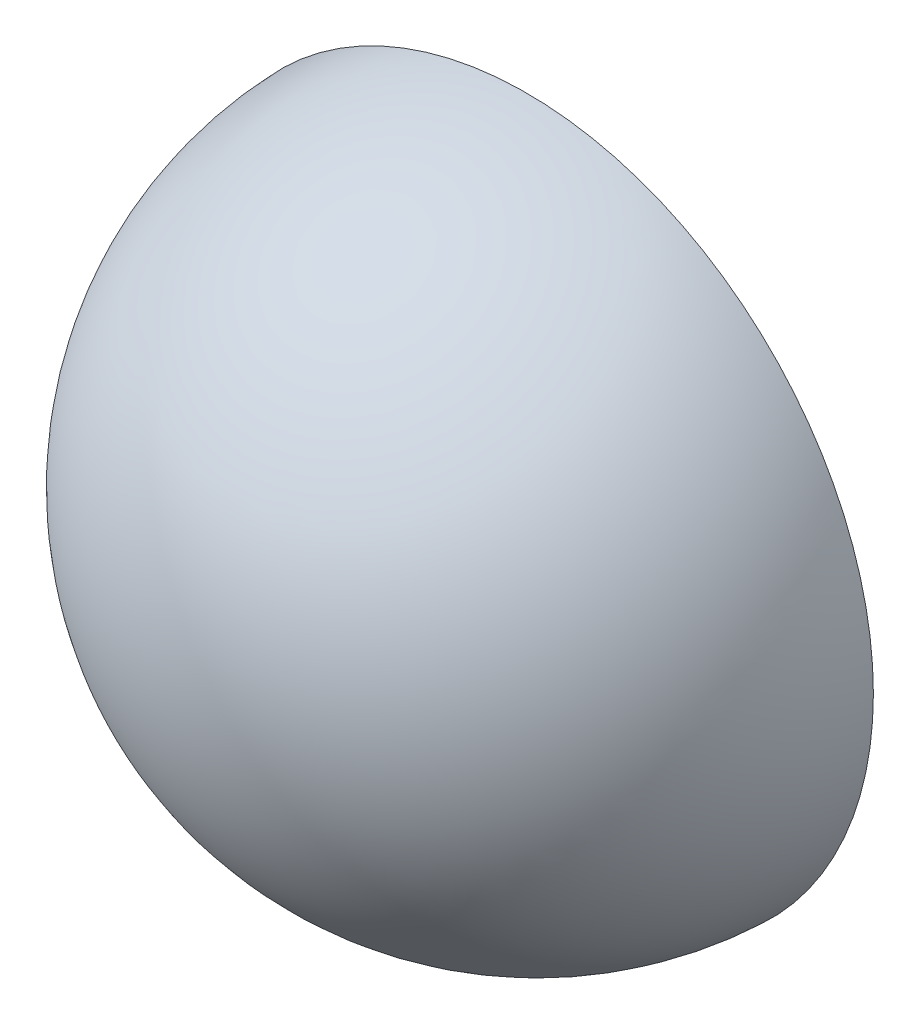
ISO-10303-21;
HEADER;
FILE_DESCRIPTION(('STEP AP214'),'2;1');
FILE_NAME('part.step','',(''),(''),'','','');
FILE_SCHEMA(('AUTOMOTIVE_DESIGN { 1 0 10303 214 1 1 1 1 }'));
ENDSEC;
DATA;
#1=APPLICATION_CONTEXT('core data for automotive mechanical design processes');
#2=APPLICATION_PROTOCOL_DEFINITION('international standard','automotive_design',2000,#1);
#3=PRODUCT_CONTEXT('',#1,'mechanical');
#4=PRODUCT('Part','Part','',(#3));
#5=PRODUCT_RELATED_PRODUCT_CATEGORY('part','',(#4));
#6=PRODUCT_DEFINITION_FORMATION('','',#4);
#7=PRODUCT_DEFINITION_CONTEXT('part definition',#1,'design');
#8=PRODUCT_DEFINITION('design','',#6,#7);
#9=PRODUCT_DEFINITION_SHAPE('','',#8);
#10=(LENGTH_UNIT() NAMED_UNIT(*) SI_UNIT(.MILLI.,.METRE.));
#11=(NAMED_UNIT(*) PLANE_ANGLE_UNIT() SI_UNIT($,.RADIAN.));
#12=(NAMED_UNIT(*) SI_UNIT($,.STERADIAN.) SOLID_ANGLE_UNIT());
#13=UNCERTAINTY_MEASURE_WITH_UNIT(LENGTH_MEASURE(1.E-05),#10,'distance_accuracy_value','');
#14=(GEOMETRIC_REPRESENTATION_CONTEXT(3) GLOBAL_UNCERTAINTY_ASSIGNED_CONTEXT((#13)) GLOBAL_UNIT_ASSIGNED_CONTEXT((#10,
#11,#12)) REPRESENTATION_CONTEXT('',''));
#15=CARTESIAN_POINT('',(0.,0.,0.));
#16=DIRECTION('',(0.,0.,1.));
#17=DIRECTION('',(1.,0.,0.));
#18=AXIS2_PLACEMENT_3D('',#15,#16,#17);
#19=CARTESIAN_POINT('',(0.,0.,60.5884170421692));
#20=DIRECTION('',(0.,0.,1.));
#21=DIRECTION('',(1.,0.,0.));
#22=AXIS2_PLACEMENT_3D('',#19,#20,#21);
#23=SPHERICAL_SURFACE('',#22,11.341714842274);
#24=CARTESIAN_POINT('',(0.,0.,60.9277738914806));
#25=DIRECTION('',(0.,0.,1.));
#26=DIRECTION('',(1.,0.,0.));
#27=AXIS2_PLACEMENT_3D('',#24,#25,#26);
#28=CIRCLE('',#27,11.3366367363642);
#29=CARTESIAN_POINT('',(11.3366367363642,0.,60.9277738914806));
#30=VERTEX_POINT('',#29);
#31=EDGE_CURVE('E50',#30,#30,#28,.T.);
#32=ORIENTED_EDGE('',*,*,#31,.T.);
#33=EDGE_LOOP('',(#32));
#34=FACE_BOUND('',#33,.T.);
#35=ADVANCED_FACE('F43',(#34),#23,.T.);
#36=CARTESIAN_POINT('',(0.,0.,60.9277738914806));
#37=DIRECTION('',(0.,0.,1.));
#38=DIRECTION('',(1.,0.,0.));
#39=AXIS2_PLACEMENT_3D('',#36,#37,#38);
#40=SPHERICAL_SURFACE('',#39,10.4872069258655);
#41=CARTESIAN_POINT('',(0.,0.,60.9277738914806));
#42=DIRECTION('',(0.,0.,1.));
#43=DIRECTION('',(1.,0.,0.));
#44=AXIS2_PLACEMENT_3D('',#41,#42,#43);
#45=CIRCLE('',#44,10.4872069258655);
#46=CARTESIAN_POINT('',(10.4872069258655,0.,60.9277738914806));
#47=VERTEX_POINT('',#46);
#48=EDGE_CURVE('E10',#47,#47,#45,.T.);
#49=ORIENTED_EDGE('',*,*,#48,.F.);
#50=EDGE_LOOP('',(#49));
#51=FACE_BOUND('',#50,.T.);
#52=ADVANCED_FACE('F60',(#51),#40,.F.);
#53=CARTESIAN_POINT('',(10.4872069258655,0.,60.9277738914806));
#54=DIRECTION('',(0.,0.,-1.));
#55=DIRECTION('',(-1.,0.,0.));
#56=AXIS2_PLACEMENT_3D('',#53,#54,#55);
#57=PLANE('',#56);
#58=ORIENTED_EDGE('',*,*,#48,.T.);
#59=EDGE_LOOP('',(#58));
#60=FACE_BOUND('',#59,.T.);
#61=ORIENTED_EDGE('',*,*,#31,.F.);
#62=EDGE_LOOP('',(#61));
#63=FACE_BOUND('',#62,.T.);
#64=ADVANCED_FACE('F58',(#60,#63),#57,.T.);
#65=CLOSED_SHELL('',(#35,#52,#64));
#66=MANIFOLD_SOLID_BREP('B2',#65);
#67=ADVANCED_BREP_SHAPE_REPRESENTATION('',(#18,#66),#14);
#68=SHAPE_DEFINITION_REPRESENTATION(#9,#67);
ENDSEC;
END-ISO-10303-21;
